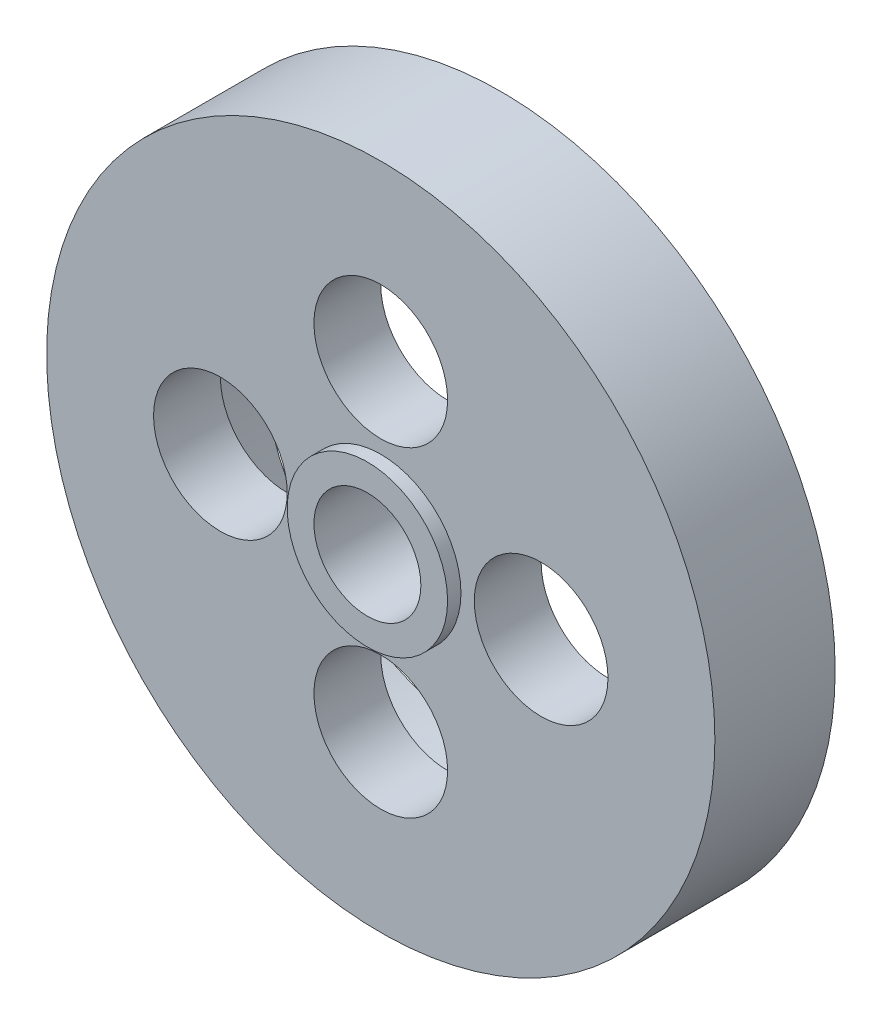
ISO-10303-21;
HEADER;
FILE_DESCRIPTION(('STEP AP214'),'2;1');
FILE_NAME('part.step','',(''),(''),'','','');
FILE_SCHEMA(('AUTOMOTIVE_DESIGN { 1 0 10303 214 1 1 1 1 }'));
ENDSEC;
DATA;
#1=APPLICATION_CONTEXT('core data for automotive mechanical design processes');
#2=APPLICATION_PROTOCOL_DEFINITION('international standard','automotive_design',2000,#1);
#3=PRODUCT_CONTEXT('',#1,'mechanical');
#4=PRODUCT('Part','Part','',(#3));
#5=PRODUCT_RELATED_PRODUCT_CATEGORY('part','',(#4));
#6=PRODUCT_DEFINITION_FORMATION('','',#4);
#7=PRODUCT_DEFINITION_CONTEXT('part definition',#1,'design');
#8=PRODUCT_DEFINITION('design','',#6,#7);
#9=PRODUCT_DEFINITION_SHAPE('','',#8);
#10=(LENGTH_UNIT() NAMED_UNIT(*) SI_UNIT(.MILLI.,.METRE.));
#11=(NAMED_UNIT(*) PLANE_ANGLE_UNIT() SI_UNIT($,.RADIAN.));
#12=(NAMED_UNIT(*) SI_UNIT($,.STERADIAN.) SOLID_ANGLE_UNIT());
#13=UNCERTAINTY_MEASURE_WITH_UNIT(LENGTH_MEASURE(1.E-05),#10,'distance_accuracy_value','');
#14=(GEOMETRIC_REPRESENTATION_CONTEXT(3) GLOBAL_UNCERTAINTY_ASSIGNED_CONTEXT((#13)) GLOBAL_UNIT_ASSIGNED_CONTEXT((#10,
#11,#12)) REPRESENTATION_CONTEXT('',''));
#15=CARTESIAN_POINT('',(0.,0.,0.));
#16=DIRECTION('',(0.,0.,1.));
#17=DIRECTION('',(1.,0.,0.));
#18=AXIS2_PLACEMENT_3D('',#15,#16,#17);
#19=CARTESIAN_POINT('',(0.,0.,9.));
#20=DIRECTION('',(0.,0.,1.));
#21=DIRECTION('',(1.,0.,0.));
#22=AXIS2_PLACEMENT_3D('',#19,#20,#21);
#23=PLANE('',#22);
#24=CARTESIAN_POINT('',(0.,-12.,9.));
#25=DIRECTION('',(0.,0.,1.));
#26=DIRECTION('',(1.,0.,0.));
#27=AXIS2_PLACEMENT_3D('',#24,#25,#26);
#28=CIRCLE('',#27,5.);
#29=CARTESIAN_POINT('',(5.,-12.,9.));
#30=VERTEX_POINT('',#29);
#31=EDGE_CURVE('E56',#30,#30,#28,.T.);
#32=ORIENTED_EDGE('',*,*,#31,.F.);
#33=EDGE_LOOP('',(#32));
#34=FACE_BOUND('',#33,.T.);
#35=CARTESIAN_POINT('',(0.,12.,9.));
#36=DIRECTION('',(0.,0.,1.));
#37=DIRECTION('',(1.,0.,0.));
#38=AXIS2_PLACEMENT_3D('',#35,#36,#37);
#39=CIRCLE('',#38,5.);
#40=CARTESIAN_POINT('',(5.,12.,9.));
#41=VERTEX_POINT('',#40);
#42=EDGE_CURVE('E49',#41,#41,#39,.T.);
#43=ORIENTED_EDGE('',*,*,#42,.F.);
#44=EDGE_LOOP('',(#43));
#45=FACE_BOUND('',#44,.T.);
#46=CARTESIAN_POINT('',(0.,0.,9.));
#47=DIRECTION('',(0.,0.,1.));
#48=DIRECTION('',(1.,0.,0.));
#49=AXIS2_PLACEMENT_3D('',#46,#47,#48);
#50=CIRCLE('',#49,25.);
#51=CARTESIAN_POINT('',(25.,0.,9.));
#52=VERTEX_POINT('',#51);
#53=EDGE_CURVE('E10',#52,#52,#50,.T.);
#54=ORIENTED_EDGE('',*,*,#53,.T.);
#55=EDGE_LOOP('',(#54));
#56=FACE_BOUND('',#55,.T.);
#57=CARTESIAN_POINT('',(12.,0.,9.));
#58=DIRECTION('',(0.,0.,1.));
#59=DIRECTION('',(1.,0.,0.));
#60=AXIS2_PLACEMENT_3D('',#57,#58,#59);
#61=CIRCLE('',#60,5.);
#62=CARTESIAN_POINT('',(17.,0.,9.));
#63=VERTEX_POINT('',#62);
#64=EDGE_CURVE('E53',#63,#63,#61,.T.);
#65=ORIENTED_EDGE('',*,*,#64,.F.);
#66=EDGE_LOOP('',(#65));
#67=FACE_BOUND('',#66,.T.);
#68=CARTESIAN_POINT('',(-12.,0.,9.));
#69=DIRECTION('',(0.,0.,1.));
#70=DIRECTION('',(1.,0.,0.));
#71=AXIS2_PLACEMENT_3D('',#68,#69,#70);
#72=CIRCLE('',#71,5.);
#73=CARTESIAN_POINT('',(-7.,0.,9.));
#74=VERTEX_POINT('',#73);
#75=EDGE_CURVE('E59',#74,#74,#72,.T.);
#76=ORIENTED_EDGE('',*,*,#75,.F.);
#77=EDGE_LOOP('',(#76));
#78=FACE_BOUND('',#77,.T.);
#79=CARTESIAN_POINT('',(0.,0.,9.));
#80=DIRECTION('',(0.,0.,1.));
#81=DIRECTION('',(1.,0.,0.));
#82=AXIS2_PLACEMENT_3D('',#79,#80,#81);
#83=CIRCLE('',#82,6.);
#84=CARTESIAN_POINT('',(6.,0.,9.));
#85=VERTEX_POINT('',#84);
#86=EDGE_CURVE('E81',#85,#85,#83,.T.);
#87=ORIENTED_EDGE('',*,*,#86,.F.);
#88=EDGE_LOOP('',(#87));
#89=FACE_BOUND('',#88,.T.);
#90=ADVANCED_FACE('F36',(#34,#45,#56,#67,#78,#89),#23,.T.);
#91=CARTESIAN_POINT('',(0.,12.,9.));
#92=DIRECTION('',(0.,0.,-1.));
#93=DIRECTION('',(-1.,0.,0.));
#94=AXIS2_PLACEMENT_3D('',#91,#92,#93);
#95=CYLINDRICAL_SURFACE('',#94,5.);
#96=ORIENTED_EDGE('',*,*,#42,.T.);
#97=EDGE_LOOP('',(#96));
#98=FACE_BOUND('',#97,.T.);
#99=CARTESIAN_POINT('',(0.,12.,4.));
#100=DIRECTION('',(0.,0.,-1.));
#101=DIRECTION('',(-1.,0.,0.));
#102=AXIS2_PLACEMENT_3D('',#99,#100,#101);
#103=CIRCLE('',#102,5.);
#104=CARTESIAN_POINT('',(-5.,12.,4.));
#105=VERTEX_POINT('',#104);
#106=EDGE_CURVE('E62',#105,#105,#103,.T.);
#107=ORIENTED_EDGE('',*,*,#106,.T.);
#108=EDGE_LOOP('',(#107));
#109=FACE_BOUND('',#108,.T.);
#110=ADVANCED_FACE('F108',(#98,#109),#95,.F.);
#111=CARTESIAN_POINT('',(12.,0.,9.));
#112=DIRECTION('',(0.,0.,-1.));
#113=DIRECTION('',(-1.,0.,0.));
#114=AXIS2_PLACEMENT_3D('',#111,#112,#113);
#115=CYLINDRICAL_SURFACE('',#114,5.);
#116=ORIENTED_EDGE('',*,*,#64,.T.);
#117=EDGE_LOOP('',(#116));
#118=FACE_BOUND('',#117,.T.);
#119=CARTESIAN_POINT('',(12.,0.,4.));
#120=DIRECTION('',(0.,0.,-1.));
#121=DIRECTION('',(-1.,0.,0.));
#122=AXIS2_PLACEMENT_3D('',#119,#120,#121);
#123=CIRCLE('',#122,5.);
#124=CARTESIAN_POINT('',(7.,0.,4.));
#125=VERTEX_POINT('',#124);
#126=EDGE_CURVE('E65',#125,#125,#123,.T.);
#127=ORIENTED_EDGE('',*,*,#126,.T.);
#128=EDGE_LOOP('',(#127));
#129=FACE_BOUND('',#128,.T.);
#130=ADVANCED_FACE('F114',(#118,#129),#115,.F.);
#131=CARTESIAN_POINT('',(0.,-12.,9.));
#132=DIRECTION('',(0.,0.,-1.));
#133=DIRECTION('',(-1.,0.,0.));
#134=AXIS2_PLACEMENT_3D('',#131,#132,#133);
#135=CYLINDRICAL_SURFACE('',#134,5.);
#136=ORIENTED_EDGE('',*,*,#31,.T.);
#137=EDGE_LOOP('',(#136));
#138=FACE_BOUND('',#137,.T.);
#139=CARTESIAN_POINT('',(0.,-12.,4.));
#140=DIRECTION('',(0.,0.,-1.));
#141=DIRECTION('',(-1.,0.,0.));
#142=AXIS2_PLACEMENT_3D('',#139,#140,#141);
#143=CIRCLE('',#142,5.);
#144=CARTESIAN_POINT('',(-5.,-12.,4.));
#145=VERTEX_POINT('',#144);
#146=EDGE_CURVE('E68',#145,#145,#143,.T.);
#147=ORIENTED_EDGE('',*,*,#146,.T.);
#148=EDGE_LOOP('',(#147));
#149=FACE_BOUND('',#148,.T.);
#150=ADVANCED_FACE('F145',(#138,#149),#135,.F.);
#151=CARTESIAN_POINT('',(-12.,0.,9.));
#152=DIRECTION('',(0.,0.,-1.));
#153=DIRECTION('',(-1.,0.,0.));
#154=AXIS2_PLACEMENT_3D('',#151,#152,#153);
#155=CYLINDRICAL_SURFACE('',#154,5.);
#156=ORIENTED_EDGE('',*,*,#75,.T.);
#157=EDGE_LOOP('',(#156));
#158=FACE_BOUND('',#157,.T.);
#159=CARTESIAN_POINT('',(-12.,0.,4.));
#160=DIRECTION('',(0.,0.,-1.));
#161=DIRECTION('',(-1.,0.,0.));
#162=AXIS2_PLACEMENT_3D('',#159,#160,#161);
#163=CIRCLE('',#162,5.);
#164=CARTESIAN_POINT('',(-17.,0.,4.));
#165=VERTEX_POINT('',#164);
#166=EDGE_CURVE('E71',#165,#165,#163,.T.);
#167=ORIENTED_EDGE('',*,*,#166,.T.);
#168=EDGE_LOOP('',(#167));
#169=FACE_BOUND('',#168,.T.);
#170=ADVANCED_FACE('F128',(#158,#169),#155,.F.);
#171=CARTESIAN_POINT('',(0.,0.,9.));
#172=DIRECTION('',(0.,0.,-1.));
#173=DIRECTION('',(-1.,0.,0.));
#174=AXIS2_PLACEMENT_3D('',#171,#172,#173);
#175=CYLINDRICAL_SURFACE('',#174,4.);
#176=CARTESIAN_POINT('',(0.,0.,4.));
#177=DIRECTION('',(0.,0.,-1.));
#178=DIRECTION('',(-1.,0.,0.));
#179=AXIS2_PLACEMENT_3D('',#176,#177,#178);
#180=CIRCLE('',#179,4.);
#181=CARTESIAN_POINT('',(-4.,0.,4.));
#182=VERTEX_POINT('',#181);
#183=EDGE_CURVE('E40',#182,#182,#180,.T.);
#184=ORIENTED_EDGE('',*,*,#183,.T.);
#185=EDGE_LOOP('',(#184));
#186=FACE_BOUND('',#185,.T.);
#187=CARTESIAN_POINT('',(0.,0.,10.));
#188=DIRECTION('',(0.,0.,1.));
#189=DIRECTION('',(1.,0.,0.));
#190=AXIS2_PLACEMENT_3D('',#187,#188,#189);
#191=CIRCLE('',#190,4.);
#192=CARTESIAN_POINT('',(4.,0.,10.));
#193=VERTEX_POINT('',#192);
#194=EDGE_CURVE('E84',#193,#193,#191,.T.);
#195=ORIENTED_EDGE('',*,*,#194,.T.);
#196=EDGE_LOOP('',(#195));
#197=FACE_BOUND('',#196,.T.);
#198=ADVANCED_FACE('F90',(#186,#197),#175,.F.);
#199=CARTESIAN_POINT('',(0.,0.,0.));
#200=DIRECTION('',(0.,0.,1.));
#201=DIRECTION('',(1.,0.,0.));
#202=AXIS2_PLACEMENT_3D('',#199,#200,#201);
#203=PLANE('',#202);
#204=CARTESIAN_POINT('',(0.,0.,0.));
#205=DIRECTION('',(0.,0.,-1.));
#206=DIRECTION('',(-1.,0.,0.));
#207=AXIS2_PLACEMENT_3D('',#204,#205,#206);
#208=CIRCLE('',#207,18.);
#209=CARTESIAN_POINT('',(-18.,0.,0.));
#210=VERTEX_POINT('',#209);
#211=EDGE_CURVE('E74',#210,#210,#208,.T.);
#212=ORIENTED_EDGE('',*,*,#211,.F.);
#213=EDGE_LOOP('',(#212));
#214=FACE_BOUND('',#213,.T.);
#215=CARTESIAN_POINT('',(0.,0.,0.));
#216=DIRECTION('',(0.,0.,1.));
#217=DIRECTION('',(1.,0.,0.));
#218=AXIS2_PLACEMENT_3D('',#215,#216,#217);
#219=CIRCLE('',#218,25.);
#220=CARTESIAN_POINT('',(25.,0.,0.));
#221=VERTEX_POINT('',#220);
#222=EDGE_CURVE('E44',#221,#221,#219,.T.);
#223=ORIENTED_EDGE('',*,*,#222,.F.);
#224=EDGE_LOOP('',(#223));
#225=FACE_BOUND('',#224,.T.);
#226=ADVANCED_FACE('F120',(#214,#225),#203,.F.);
#227=CARTESIAN_POINT('',(0.,0.,9.));
#228=DIRECTION('',(0.,0.,-1.));
#229=DIRECTION('',(-1.,0.,0.));
#230=AXIS2_PLACEMENT_3D('',#227,#228,#229);
#231=CYLINDRICAL_SURFACE('',#230,25.);
#232=ORIENTED_EDGE('',*,*,#53,.F.);
#233=EDGE_LOOP('',(#232));
#234=FACE_BOUND('',#233,.T.);
#235=ORIENTED_EDGE('',*,*,#222,.T.);
#236=EDGE_LOOP('',(#235));
#237=FACE_BOUND('',#236,.T.);
#238=ADVANCED_FACE('F38',(#234,#237),#231,.T.);
#239=CARTESIAN_POINT('',(0.,0.,4.));
#240=DIRECTION('',(0.,0.,-1.));
#241=DIRECTION('',(-1.,0.,0.));
#242=AXIS2_PLACEMENT_3D('',#239,#240,#241);
#243=CYLINDRICAL_SURFACE('',#242,18.);
#244=CARTESIAN_POINT('',(0.,0.,4.));
#245=DIRECTION('',(0.,0.,-1.));
#246=DIRECTION('',(-1.,0.,0.));
#247=AXIS2_PLACEMENT_3D('',#244,#245,#246);
#248=CIRCLE('',#247,18.);
#249=CARTESIAN_POINT('',(-18.,0.,4.));
#250=VERTEX_POINT('',#249);
#251=EDGE_CURVE('E77',#250,#250,#248,.T.);
#252=ORIENTED_EDGE('',*,*,#251,.F.);
#253=EDGE_LOOP('',(#252));
#254=FACE_BOUND('',#253,.T.);
#255=ORIENTED_EDGE('',*,*,#211,.T.);
#256=EDGE_LOOP('',(#255));
#257=FACE_BOUND('',#256,.T.);
#258=ADVANCED_FACE('F104',(#254,#257),#243,.F.);
#259=CARTESIAN_POINT('',(0.,0.,4.));
#260=DIRECTION('',(0.,0.,-1.));
#261=DIRECTION('',(-1.,0.,0.));
#262=AXIS2_PLACEMENT_3D('',#259,#260,#261);
#263=PLANE('',#262);
#264=ORIENTED_EDGE('',*,*,#106,.F.);
#265=EDGE_LOOP('',(#264));
#266=FACE_BOUND('',#265,.T.);
#267=ORIENTED_EDGE('',*,*,#126,.F.);
#268=EDGE_LOOP('',(#267));
#269=FACE_BOUND('',#268,.T.);
#270=ORIENTED_EDGE('',*,*,#146,.F.);
#271=EDGE_LOOP('',(#270));
#272=FACE_BOUND('',#271,.T.);
#273=ORIENTED_EDGE('',*,*,#166,.F.);
#274=EDGE_LOOP('',(#273));
#275=FACE_BOUND('',#274,.T.);
#276=ORIENTED_EDGE('',*,*,#183,.F.);
#277=EDGE_LOOP('',(#276));
#278=FACE_BOUND('',#277,.T.);
#279=ORIENTED_EDGE('',*,*,#251,.T.);
#280=EDGE_LOOP('',(#279));
#281=FACE_BOUND('',#280,.T.);
#282=ADVANCED_FACE('F95',(#266,#269,#272,#275,#278,#281),#263,.T.);
#283=CARTESIAN_POINT('',(0.,0.,10.));
#284=DIRECTION('',(0.,0.,1.));
#285=DIRECTION('',(1.,0.,0.));
#286=AXIS2_PLACEMENT_3D('',#283,#284,#285);
#287=PLANE('',#286);
#288=CARTESIAN_POINT('',(0.,0.,10.));
#289=DIRECTION('',(0.,0.,1.));
#290=DIRECTION('',(1.,0.,0.));
#291=AXIS2_PLACEMENT_3D('',#288,#289,#290);
#292=CIRCLE('',#291,6.);
#293=CARTESIAN_POINT('',(6.,0.,10.));
#294=VERTEX_POINT('',#293);
#295=EDGE_CURVE('E78',#294,#294,#292,.T.);
#296=ORIENTED_EDGE('',*,*,#295,.T.);
#297=EDGE_LOOP('',(#296));
#298=FACE_BOUND('',#297,.T.);
#299=ORIENTED_EDGE('',*,*,#194,.F.);
#300=EDGE_LOOP('',(#299));
#301=FACE_BOUND('',#300,.T.);
#302=ADVANCED_FACE('F92',(#298,#301),#287,.T.);
#303=CARTESIAN_POINT('',(0.,0.,10.));
#304=DIRECTION('',(0.,0.,-1.));
#305=DIRECTION('',(-1.,0.,0.));
#306=AXIS2_PLACEMENT_3D('',#303,#304,#305);
#307=CYLINDRICAL_SURFACE('',#306,6.);
#308=ORIENTED_EDGE('',*,*,#295,.F.);
#309=EDGE_LOOP('',(#308));
#310=FACE_BOUND('',#309,.T.);
#311=ORIENTED_EDGE('',*,*,#86,.T.);
#312=EDGE_LOOP('',(#311));
#313=FACE_BOUND('',#312,.T.);
#314=ADVANCED_FACE('F94',(#310,#313),#307,.T.);
#315=CLOSED_SHELL('',(#90,#110,#130,#150,#170,#198,#226,#238,#258,#282,#302,#314));
#316=MANIFOLD_SOLID_BREP('B2',#315);
#317=ADVANCED_BREP_SHAPE_REPRESENTATION('',(#18,#316),#14);
#318=SHAPE_DEFINITION_REPRESENTATION(#9,#317);
ENDSEC;
END-ISO-10303-21;
